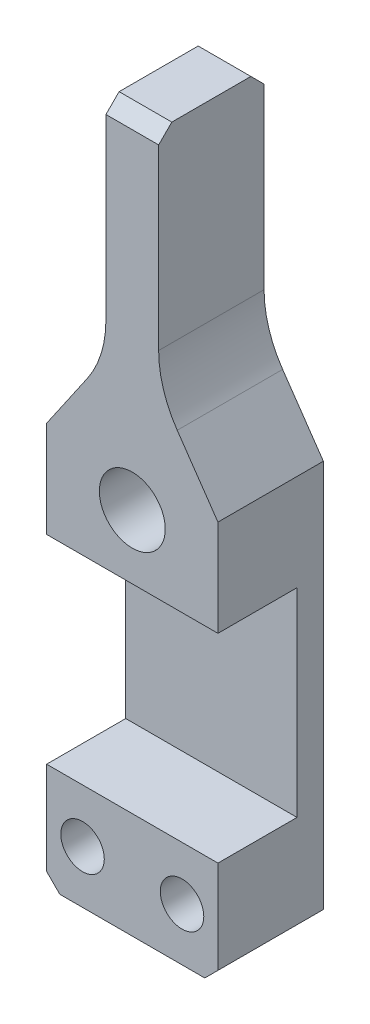
ISO-10303-21;
HEADER;
FILE_DESCRIPTION(('STEP AP214'),'2;1');
FILE_NAME('part.step','',(''),(''),'','','');
FILE_SCHEMA(('AUTOMOTIVE_DESIGN { 1 0 10303 214 1 1 1 1 }'));
ENDSEC;
DATA;
#1=APPLICATION_CONTEXT('core data for automotive mechanical design processes');
#2=APPLICATION_PROTOCOL_DEFINITION('international standard','automotive_design',2000,#1);
#3=PRODUCT_CONTEXT('',#1,'mechanical');
#4=PRODUCT('Part','Part','',(#3));
#5=PRODUCT_RELATED_PRODUCT_CATEGORY('part','',(#4));
#6=PRODUCT_DEFINITION_FORMATION('','',#4);
#7=PRODUCT_DEFINITION_CONTEXT('part definition',#1,'design');
#8=PRODUCT_DEFINITION('design','',#6,#7);
#9=PRODUCT_DEFINITION_SHAPE('','',#8);
#10=(LENGTH_UNIT() NAMED_UNIT(*) SI_UNIT(.MILLI.,.METRE.));
#11=(NAMED_UNIT(*) PLANE_ANGLE_UNIT() SI_UNIT($,.RADIAN.));
#12=(NAMED_UNIT(*) SI_UNIT($,.STERADIAN.) SOLID_ANGLE_UNIT());
#13=UNCERTAINTY_MEASURE_WITH_UNIT(LENGTH_MEASURE(1.E-05),#10,'distance_accuracy_value','');
#14=(GEOMETRIC_REPRESENTATION_CONTEXT(3) GLOBAL_UNCERTAINTY_ASSIGNED_CONTEXT((#13)) GLOBAL_UNIT_ASSIGNED_CONTEXT((#10,
#11,#12)) REPRESENTATION_CONTEXT('',''));
#15=CARTESIAN_POINT('',(0.,0.,0.));
#16=DIRECTION('',(0.,0.,1.));
#17=DIRECTION('',(1.,0.,0.));
#18=AXIS2_PLACEMENT_3D('',#15,#16,#17);
#19=CARTESIAN_POINT('',(0.,0.,8.));
#20=DIRECTION('',(0.,0.,-1.));
#21=DIRECTION('',(-1.,0.,0.));
#22=AXIS2_PLACEMENT_3D('',#19,#20,#21);
#23=PLANE('',#22);
#24=CARTESIAN_POINT('',(0.,0.500000000000004,8.));
#25=DIRECTION('',(0.,0.,1.));
#26=DIRECTION('',(1.,0.,0.));
#27=AXIS2_PLACEMENT_3D('',#24,#25,#26);
#28=CIRCLE('',#27,2.5);
#29=CARTESIAN_POINT('',(2.5,0.500000000000004,8.));
#30=VERTEX_POINT('',#29);
#31=EDGE_CURVE('E349',#30,#30,#28,.T.);
#32=ORIENTED_EDGE('',*,*,#31,.F.);
#33=EDGE_LOOP('',(#32));
#34=FACE_BOUND('',#33,.T.);
#35=DIRECTION('',(0.,-1.,0.));
#36=VECTOR('',#35,1.);
#37=CARTESIAN_POINT('',(-6.5,27.5,8.));
#38=LINE('',#37,#36);
#39=CARTESIAN_POINT('',(-6.5,2.96165158468899,8.));
#40=VERTEX_POINT('',#39);
#41=CARTESIAN_POINT('',(-6.5,-4.34917334973761,8.));
#42=VERTEX_POINT('',#41);
#43=EDGE_CURVE('E178',#40,#42,#38,.T.);
#44=ORIENTED_EDGE('',*,*,#43,.T.);
#45=DIRECTION('',(1.,0.,0.));
#46=VECTOR('',#45,1.);
#47=CARTESIAN_POINT('',(-6.5,-4.34917334973761,8.));
#48=LINE('',#47,#46);
#49=CARTESIAN_POINT('',(6.5,-4.34917334973761,8.));
#50=VERTEX_POINT('',#49);
#51=EDGE_CURVE('E163',#42,#50,#48,.T.);
#52=ORIENTED_EDGE('',*,*,#51,.T.);
#53=DIRECTION('',(0.,1.,0.));
#54=VECTOR('',#53,1.);
#55=CARTESIAN_POINT('',(6.5,27.5,8.));
#56=LINE('',#55,#54);
#57=CARTESIAN_POINT('',(6.5,2.96165158468893,8.));
#58=VERTEX_POINT('',#57);
#59=EDGE_CURVE('E188',#50,#58,#56,.T.);
#60=ORIENTED_EDGE('',*,*,#59,.T.);
#61=DIRECTION('',(-0.566946709513834,0.823754471047919,0.));
#62=VECTOR('',#61,1.);
#63=CARTESIAN_POINT('',(6.5,2.96165158468891,8.));
#64=LINE('',#63,#62);
#65=CARTESIAN_POINT('',(3.40996423161665,7.45136946679201,8.));
#66=VERTEX_POINT('',#65);
#67=EDGE_CURVE('E229',#58,#66,#64,.T.);
#68=ORIENTED_EDGE('',*,*,#67,.T.);
#69=CARTESIAN_POINT('',(10.,11.9869431429027,8.));
#70=DIRECTION('',(0.,0.,-1.));
#71=DIRECTION('',(-1.,0.,0.));
#72=AXIS2_PLACEMENT_3D('',#69,#70,#71);
#73=CIRCLE('',#72,8.);
#74=CARTESIAN_POINT('',(2.,11.9869431429027,8.));
#75=VERTEX_POINT('',#74);
#76=EDGE_CURVE('E271',#66,#75,#73,.T.);
#77=ORIENTED_EDGE('',*,*,#76,.T.);
#78=DIRECTION('',(0.,-1.,0.));
#79=VECTOR('',#78,1.);
#80=CARTESIAN_POINT('',(2.,27.5,8.));
#81=LINE('',#80,#79);
#82=CARTESIAN_POINT('',(2.,25.5,8.));
#83=VERTEX_POINT('',#82);
#84=EDGE_CURVE('E275',#83,#75,#81,.T.);
#85=ORIENTED_EDGE('',*,*,#84,.F.);
#86=DIRECTION('',(-1.,0.,0.));
#87=VECTOR('',#86,1.);
#88=CARTESIAN_POINT('',(0.,25.5,8.));
#89=LINE('',#88,#87);
#90=CARTESIAN_POINT('',(-2.,25.5,8.));
#91=VERTEX_POINT('',#90);
#92=EDGE_CURVE('E256',#83,#91,#89,.T.);
#93=ORIENTED_EDGE('',*,*,#92,.T.);
#94=DIRECTION('',(0.,1.,0.));
#95=VECTOR('',#94,1.);
#96=CARTESIAN_POINT('',(-2.,27.5,8.));
#97=LINE('',#96,#95);
#98=CARTESIAN_POINT('',(-2.,11.9869431429027,8.));
#99=VERTEX_POINT('',#98);
#100=EDGE_CURVE('E346',#99,#91,#97,.T.);
#101=ORIENTED_EDGE('',*,*,#100,.F.);
#102=CARTESIAN_POINT('',(-10.,11.9869431429027,8.));
#103=DIRECTION('',(0.,0.,-1.));
#104=DIRECTION('',(-1.,0.,0.));
#105=AXIS2_PLACEMENT_3D('',#102,#103,#104);
#106=CIRCLE('',#105,8.);
#107=CARTESIAN_POINT('',(-3.40996423161669,7.45136946679193,8.));
#108=VERTEX_POINT('',#107);
#109=EDGE_CURVE('E48',#99,#108,#106,.T.);
#110=ORIENTED_EDGE('',*,*,#109,.T.);
#111=DIRECTION('',(-0.566946709513842,-0.823754471047913,0.));
#112=VECTOR('',#111,1.);
#113=CARTESIAN_POINT('',(-3.28571428571426,7.6319004527683,8.));
#114=LINE('',#113,#112);
#115=EDGE_CURVE('E183',#108,#40,#114,.T.);
#116=ORIENTED_EDGE('',*,*,#115,.T.);
#117=EDGE_LOOP('',(#44,#52,#60,#68,#77,#85,#93,#101,#110,#116));
#118=FACE_BOUND('',#117,.T.);
#119=ADVANCED_FACE('F40',(#34,#118),#23,.F.);
#120=CARTESIAN_POINT('',(-6.5,27.5,8.));
#121=DIRECTION('',(1.,0.,0.));
#122=DIRECTION('',(0.,1.,0.));
#123=AXIS2_PLACEMENT_3D('',#120,#121,#122);
#124=PLANE('',#123);
#125=DIRECTION('',(0.,1.,0.));
#126=VECTOR('',#125,1.);
#127=CARTESIAN_POINT('',(-6.5,-4.34917334973761,1.9988763965415));
#128=LINE('',#127,#126);
#129=CARTESIAN_POINT('',(-6.5,-19.4477044804842,1.9988763965415));
#130=VERTEX_POINT('',#129);
#131=CARTESIAN_POINT('',(-6.5,-4.34917334973761,1.9988763965415));
#132=VERTEX_POINT('',#131);
#133=EDGE_CURVE('E173',#130,#132,#128,.T.);
#134=ORIENTED_EDGE('',*,*,#133,.T.);
#135=DIRECTION('',(0.,0.,1.));
#136=VECTOR('',#135,1.);
#137=CARTESIAN_POINT('',(-6.5,-4.34917334973761,8.));
#138=LINE('',#137,#136);
#139=EDGE_CURVE('E166',#132,#42,#138,.T.);
#140=ORIENTED_EDGE('',*,*,#139,.T.);
#141=ORIENTED_EDGE('',*,*,#43,.F.);
#142=DIRECTION('',(0.,0.,-1.));
#143=VECTOR('',#142,1.);
#144=CARTESIAN_POINT('',(-6.5,2.96165158468899,8.));
#145=LINE('',#144,#143);
#146=CARTESIAN_POINT('',(-6.49999999999999,2.96165158468902,0.));
#147=VERTEX_POINT('',#146);
#148=EDGE_CURVE('E237',#40,#147,#145,.T.);
#149=ORIENTED_EDGE('',*,*,#148,.T.);
#150=DIRECTION('',(0.,-1.,0.));
#151=VECTOR('',#150,1.);
#152=CARTESIAN_POINT('',(-6.5,27.5,0.));
#153=LINE('',#152,#151);
#154=CARTESIAN_POINT('',(-6.5,-26.5,0.));
#155=VERTEX_POINT('',#154);
#156=EDGE_CURVE('E199',#147,#155,#153,.T.);
#157=ORIENTED_EDGE('',*,*,#156,.T.);
#158=DIRECTION('',(0.,0.,1.));
#159=VECTOR('',#158,1.);
#160=CARTESIAN_POINT('',(-6.5,-26.5,8.));
#161=LINE('',#160,#159);
#162=CARTESIAN_POINT('',(-6.49999999999999,-26.5,8.));
#163=VERTEX_POINT('',#162);
#164=EDGE_CURVE('E222',#155,#163,#161,.T.);
#165=ORIENTED_EDGE('',*,*,#164,.T.);
#166=CARTESIAN_POINT('',(-6.5,-19.4477044804842,8.));
#167=VERTEX_POINT('',#166);
#168=EDGE_CURVE('E185',#167,#163,#38,.T.);
#169=ORIENTED_EDGE('',*,*,#168,.F.);
#170=DIRECTION('',(0.,0.,-1.));
#171=VECTOR('',#170,1.);
#172=CARTESIAN_POINT('',(-6.5,-19.4477044804842,8.));
#173=LINE('',#172,#171);
#174=EDGE_CURVE('E55',#167,#130,#173,.T.);
#175=ORIENTED_EDGE('',*,*,#174,.T.);
#176=EDGE_LOOP('',(#134,#140,#141,#149,#157,#165,#169,#175));
#177=FACE_BOUND('',#176,.T.);
#178=ADVANCED_FACE('F177',(#177),#124,.F.);
#179=CARTESIAN_POINT('',(6.50000000000001,-27.5,8.));
#180=DIRECTION('',(0.,1.,0.));
#181=DIRECTION('',(0.,0.,1.));
#182=AXIS2_PLACEMENT_3D('',#179,#180,#181);
#183=PLANE('',#182);
#184=DIRECTION('',(1.,0.,0.));
#185=VECTOR('',#184,1.);
#186=CARTESIAN_POINT('',(6.50000000000001,-27.5,0.));
#187=LINE('',#186,#185);
#188=CARTESIAN_POINT('',(-5.50000000000001,-27.5,0.));
#189=VERTEX_POINT('',#188);
#190=CARTESIAN_POINT('',(5.5,-27.5,0.));
#191=VERTEX_POINT('',#190);
#192=EDGE_CURVE('E201',#189,#191,#187,.T.);
#193=ORIENTED_EDGE('',*,*,#192,.T.);
#194=DIRECTION('',(0.,0.,1.));
#195=VECTOR('',#194,1.);
#196=CARTESIAN_POINT('',(5.5,-27.5,8.));
#197=LINE('',#196,#195);
#198=CARTESIAN_POINT('',(5.5,-27.5,8.));
#199=VERTEX_POINT('',#198);
#200=EDGE_CURVE('E216',#191,#199,#197,.T.);
#201=ORIENTED_EDGE('',*,*,#200,.T.);
#202=DIRECTION('',(1.,0.,0.));
#203=VECTOR('',#202,1.);
#204=CARTESIAN_POINT('',(6.50000000000001,-27.5,8.));
#205=LINE('',#204,#203);
#206=CARTESIAN_POINT('',(-5.5,-27.5,8.));
#207=VERTEX_POINT('',#206);
#208=EDGE_CURVE('E184',#207,#199,#205,.T.);
#209=ORIENTED_EDGE('',*,*,#208,.F.);
#210=DIRECTION('',(0.,0.,-1.));
#211=VECTOR('',#210,1.);
#212=CARTESIAN_POINT('',(-5.5,-27.5,8.));
#213=LINE('',#212,#211);
#214=EDGE_CURVE('E213',#207,#189,#213,.T.);
#215=ORIENTED_EDGE('',*,*,#214,.T.);
#216=EDGE_LOOP('',(#193,#201,#209,#215));
#217=FACE_BOUND('',#216,.T.);
#218=ADVANCED_FACE('F306',(#217),#183,.F.);
#219=CARTESIAN_POINT('',(6.5,27.5,8.));
#220=DIRECTION('',(-1.,0.,0.));
#221=DIRECTION('',(0.,-1.,0.));
#222=AXIS2_PLACEMENT_3D('',#219,#220,#221);
#223=PLANE('',#222);
#224=ORIENTED_EDGE('',*,*,#59,.F.);
#225=DIRECTION('',(0.,0.,1.));
#226=VECTOR('',#225,1.);
#227=CARTESIAN_POINT('',(6.5,-4.34917334973761,8.));
#228=LINE('',#227,#226);
#229=CARTESIAN_POINT('',(6.5,-4.34917334973761,1.9988763965415));
#230=VERTEX_POINT('',#229);
#231=EDGE_CURVE('E169',#230,#50,#228,.T.);
#232=ORIENTED_EDGE('',*,*,#231,.F.);
#233=DIRECTION('',(0.,1.,0.));
#234=VECTOR('',#233,1.);
#235=CARTESIAN_POINT('',(6.5,-4.34917334973761,1.9988763965415));
#236=LINE('',#235,#234);
#237=CARTESIAN_POINT('',(6.5,-19.4477044804842,1.9988763965415));
#238=VERTEX_POINT('',#237);
#239=EDGE_CURVE('E181',#238,#230,#236,.T.);
#240=ORIENTED_EDGE('',*,*,#239,.F.);
#241=DIRECTION('',(0.,0.,-1.));
#242=VECTOR('',#241,1.);
#243=CARTESIAN_POINT('',(6.5,-19.4477044804842,8.));
#244=LINE('',#243,#242);
#245=CARTESIAN_POINT('',(6.5,-19.4477044804842,8.));
#246=VERTEX_POINT('',#245);
#247=EDGE_CURVE('E316',#246,#238,#244,.T.);
#248=ORIENTED_EDGE('',*,*,#247,.F.);
#249=CARTESIAN_POINT('',(6.50000000000001,-26.5,8.));
#250=VERTEX_POINT('',#249);
#251=EDGE_CURVE('E195',#250,#246,#56,.T.);
#252=ORIENTED_EDGE('',*,*,#251,.F.);
#253=DIRECTION('',(0.,0.,-1.));
#254=VECTOR('',#253,1.);
#255=CARTESIAN_POINT('',(6.50000000000001,-26.5,8.));
#256=LINE('',#255,#254);
#257=CARTESIAN_POINT('',(6.50000000000001,-26.5,0.));
#258=VERTEX_POINT('',#257);
#259=EDGE_CURVE('E198',#250,#258,#256,.T.);
#260=ORIENTED_EDGE('',*,*,#259,.T.);
#261=DIRECTION('',(0.,1.,0.));
#262=VECTOR('',#261,1.);
#263=CARTESIAN_POINT('',(6.5,27.5,0.));
#264=LINE('',#263,#262);
#265=CARTESIAN_POINT('',(6.5,2.96165158468892,0.));
#266=VERTEX_POINT('',#265);
#267=EDGE_CURVE('E190',#258,#266,#264,.T.);
#268=ORIENTED_EDGE('',*,*,#267,.T.);
#269=DIRECTION('',(0.,0.,1.));
#270=VECTOR('',#269,1.);
#271=CARTESIAN_POINT('',(6.5,2.96165158468891,8.));
#272=LINE('',#271,#270);
#273=EDGE_CURVE('E225',#266,#58,#272,.T.);
#274=ORIENTED_EDGE('',*,*,#273,.T.);
#275=EDGE_LOOP('',(#224,#232,#240,#248,#252,#260,#268,#274));
#276=FACE_BOUND('',#275,.T.);
#277=ADVANCED_FACE('F299',(#276),#223,.F.);
#278=CARTESIAN_POINT('',(-3.77499999991079,-23.5,8.));
#279=DIRECTION('',(0.,0.,1.));
#280=DIRECTION('',(1.,0.,0.));
#281=AXIS2_PLACEMENT_3D('',#278,#279,#280);
#282=CIRCLE('',#281,1.64999999999999);
#283=CARTESIAN_POINT('',(-2.1249999999108,-23.5,8.));
#284=VERTEX_POINT('',#283);
#285=EDGE_CURVE('E334',#284,#284,#282,.T.);
#286=ORIENTED_EDGE('',*,*,#285,.F.);
#287=EDGE_LOOP('',(#286));
#288=FACE_BOUND('',#287,.T.);
#289=CARTESIAN_POINT('',(3.77499999994489,-23.5,8.));
#290=DIRECTION('',(0.,0.,1.));
#291=DIRECTION('',(1.,0.,0.));
#292=AXIS2_PLACEMENT_3D('',#289,#290,#291);
#293=CIRCLE('',#292,1.64999999999999);
#294=CARTESIAN_POINT('',(5.42499999994488,-23.5,8.));
#295=VERTEX_POINT('',#294);
#296=EDGE_CURVE('E340',#295,#295,#293,.T.);
#297=ORIENTED_EDGE('',*,*,#296,.F.);
#298=EDGE_LOOP('',(#297));
#299=FACE_BOUND('',#298,.T.);
#300=ORIENTED_EDGE('',*,*,#251,.T.);
#301=DIRECTION('',(1.,0.,0.));
#302=VECTOR('',#301,1.);
#303=CARTESIAN_POINT('',(-6.5,-19.4477044804842,8.));
#304=LINE('',#303,#302);
#305=EDGE_CURVE('E172',#167,#246,#304,.T.);
#306=ORIENTED_EDGE('',*,*,#305,.F.);
#307=ORIENTED_EDGE('',*,*,#168,.T.);
#308=DIRECTION('',(-0.707106781186545,0.70710678118655,0.));
#309=VECTOR('',#308,1.);
#310=CARTESIAN_POINT('',(-5.5,-27.5,8.));
#311=LINE('',#310,#309);
#312=EDGE_CURVE('E218',#163,#207,#311,.F.);
#313=ORIENTED_EDGE('',*,*,#312,.T.);
#314=ORIENTED_EDGE('',*,*,#208,.T.);
#315=DIRECTION('',(-0.70710678118655,-0.707106781186545,0.));
#316=VECTOR('',#315,1.);
#317=CARTESIAN_POINT('',(6.50000000000001,-26.5,8.));
#318=LINE('',#317,#316);
#319=EDGE_CURVE('E220',#199,#250,#318,.F.);
#320=ORIENTED_EDGE('',*,*,#319,.T.);
#321=EDGE_LOOP('',(#300,#306,#307,#313,#314,#320));
#322=FACE_BOUND('',#321,.T.);
#323=ADVANCED_FACE('F312',(#288,#299,#322),#23,.F.);
#324=CARTESIAN_POINT('',(0.,0.,0.));
#325=DIRECTION('',(0.,0.,-1.));
#326=DIRECTION('',(-1.,0.,0.));
#327=AXIS2_PLACEMENT_3D('',#324,#325,#326);
#328=PLANE('',#327);
#329=DIRECTION('',(0.566946709513842,0.823754471047913,0.));
#330=VECTOR('',#329,1.);
#331=CARTESIAN_POINT('',(-5.79387928181817,3.98762120218729,0.));
#332=LINE('',#331,#330);
#333=CARTESIAN_POINT('',(-3.40996423161669,7.45136946679193,0.));
#334=VERTEX_POINT('',#333);
#335=EDGE_CURVE('E232',#147,#334,#332,.T.);
#336=ORIENTED_EDGE('',*,*,#335,.T.);
#337=CARTESIAN_POINT('',(-10.,11.9869431429027,0.));
#338=DIRECTION('',(0.,0.,-1.));
#339=DIRECTION('',(-1.,0.,0.));
#340=AXIS2_PLACEMENT_3D('',#337,#338,#339);
#341=CIRCLE('',#340,8.);
#342=CARTESIAN_POINT('',(-2.,11.9869431429027,0.));
#343=VERTEX_POINT('',#342);
#344=EDGE_CURVE('E11',#334,#343,#341,.F.);
#345=ORIENTED_EDGE('',*,*,#344,.T.);
#346=DIRECTION('',(0.,1.,0.));
#347=VECTOR('',#346,1.);
#348=CARTESIAN_POINT('',(-2.,27.5,0.));
#349=LINE('',#348,#347);
#350=CARTESIAN_POINT('',(-2.,25.5,0.));
#351=VERTEX_POINT('',#350);
#352=EDGE_CURVE('E287',#343,#351,#349,.T.);
#353=ORIENTED_EDGE('',*,*,#352,.T.);
#354=DIRECTION('',(1.,0.,0.));
#355=VECTOR('',#354,1.);
#356=CARTESIAN_POINT('',(2.,25.5,0.));
#357=LINE('',#356,#355);
#358=CARTESIAN_POINT('',(2.,25.5,0.));
#359=VERTEX_POINT('',#358);
#360=EDGE_CURVE('E250',#351,#359,#357,.T.);
#361=ORIENTED_EDGE('',*,*,#360,.T.);
#362=DIRECTION('',(0.,-1.,0.));
#363=VECTOR('',#362,1.);
#364=CARTESIAN_POINT('',(2.,27.5,0.));
#365=LINE('',#364,#363);
#366=CARTESIAN_POINT('',(2.,11.9869431429027,0.));
#367=VERTEX_POINT('',#366);
#368=EDGE_CURVE('E286',#359,#367,#365,.T.);
#369=ORIENTED_EDGE('',*,*,#368,.T.);
#370=CARTESIAN_POINT('',(10.,11.9869431429027,0.));
#371=DIRECTION('',(0.,0.,-1.));
#372=DIRECTION('',(-1.,0.,0.));
#373=AXIS2_PLACEMENT_3D('',#370,#371,#372);
#374=CIRCLE('',#373,8.);
#375=CARTESIAN_POINT('',(3.40996423161665,7.45136946679201,0.));
#376=VERTEX_POINT('',#375);
#377=EDGE_CURVE('E269',#367,#376,#374,.F.);
#378=ORIENTED_EDGE('',*,*,#377,.T.);
#379=DIRECTION('',(0.566946709513834,-0.823754471047919,0.));
#380=VECTOR('',#379,1.);
#381=CARTESIAN_POINT('',(5.79387928181819,3.98762120218722,0.));
#382=LINE('',#381,#380);
#383=EDGE_CURVE('E235',#376,#266,#382,.T.);
#384=ORIENTED_EDGE('',*,*,#383,.T.);
#385=ORIENTED_EDGE('',*,*,#267,.F.);
#386=DIRECTION('',(0.70710678118655,0.707106781186545,0.));
#387=VECTOR('',#386,1.);
#388=CARTESIAN_POINT('',(16.5,-16.5000000000001,0.));
#389=LINE('',#388,#387);
#390=EDGE_CURVE('E211',#258,#191,#389,.F.);
#391=ORIENTED_EDGE('',*,*,#390,.T.);
#392=ORIENTED_EDGE('',*,*,#192,.F.);
#393=DIRECTION('',(0.707106781186545,-0.70710678118655,0.));
#394=VECTOR('',#393,1.);
#395=CARTESIAN_POINT('',(-16.5,-16.4999999999999,0.));
#396=LINE('',#395,#394);
#397=EDGE_CURVE('E208',#189,#155,#396,.F.);
#398=ORIENTED_EDGE('',*,*,#397,.T.);
#399=ORIENTED_EDGE('',*,*,#156,.F.);
#400=EDGE_LOOP('',(#336,#345,#353,#361,#369,#378,#384,#385,#391,#392,#398,#399));
#401=FACE_BOUND('',#400,.T.);
#402=CARTESIAN_POINT('',(-3.77499999991079,-23.5,0.));
#403=DIRECTION('',(0.,0.,1.));
#404=DIRECTION('',(1.,0.,0.));
#405=AXIS2_PLACEMENT_3D('',#402,#403,#404);
#406=CIRCLE('',#405,1.65);
#407=CARTESIAN_POINT('',(-2.12499999991079,-23.5,0.));
#408=VERTEX_POINT('',#407);
#409=EDGE_CURVE('E337',#408,#408,#406,.T.);
#410=ORIENTED_EDGE('',*,*,#409,.T.);
#411=EDGE_LOOP('',(#410));
#412=FACE_BOUND('',#411,.T.);
#413=CARTESIAN_POINT('',(3.77499999994489,-23.5,0.));
#414=DIRECTION('',(0.,0.,1.));
#415=DIRECTION('',(1.,0.,0.));
#416=AXIS2_PLACEMENT_3D('',#413,#414,#415);
#417=CIRCLE('',#416,1.65);
#418=CARTESIAN_POINT('',(5.42499999994489,-23.5,0.));
#419=VERTEX_POINT('',#418);
#420=EDGE_CURVE('E343',#419,#419,#417,.T.);
#421=ORIENTED_EDGE('',*,*,#420,.T.);
#422=EDGE_LOOP('',(#421));
#423=FACE_BOUND('',#422,.T.);
#424=CARTESIAN_POINT('',(0.,0.500000000000004,0.));
#425=DIRECTION('',(0.,0.,1.));
#426=DIRECTION('',(1.,0.,0.));
#427=AXIS2_PLACEMENT_3D('',#424,#425,#426);
#428=CIRCLE('',#427,2.5);
#429=CARTESIAN_POINT('',(2.5,0.500000000000004,0.));
#430=VERTEX_POINT('',#429);
#431=EDGE_CURVE('E192',#430,#430,#428,.T.);
#432=ORIENTED_EDGE('',*,*,#431,.T.);
#433=EDGE_LOOP('',(#432));
#434=FACE_BOUND('',#433,.T.);
#435=ADVANCED_FACE('F292',(#401,#412,#423,#434),#328,.T.);
#436=CARTESIAN_POINT('',(0.,0.500000000000004,8.));
#437=DIRECTION('',(0.,0.,1.));
#438=DIRECTION('',(1.,0.,0.));
#439=AXIS2_PLACEMENT_3D('',#436,#437,#438);
#440=CYLINDRICAL_SURFACE('',#439,2.5);
#441=ORIENTED_EDGE('',*,*,#431,.F.);
#442=EDGE_LOOP('',(#441));
#443=FACE_BOUND('',#442,.T.);
#444=ORIENTED_EDGE('',*,*,#31,.T.);
#445=EDGE_LOOP('',(#444));
#446=FACE_BOUND('',#445,.T.);
#447=ADVANCED_FACE('F357',(#443,#446),#440,.F.);
#448=CARTESIAN_POINT('',(2.,27.5,0.));
#449=DIRECTION('',(-1.,0.,0.));
#450=DIRECTION('',(0.,-1.,0.));
#451=AXIS2_PLACEMENT_3D('',#448,#449,#450);
#452=PLANE('',#451);
#453=ORIENTED_EDGE('',*,*,#84,.T.);
#454=DIRECTION('',(0.,0.,-1.));
#455=VECTOR('',#454,1.);
#456=CARTESIAN_POINT('',(2.,11.9869431429027,0.));
#457=LINE('',#456,#455);
#458=EDGE_CURVE('E259',#75,#367,#457,.T.);
#459=ORIENTED_EDGE('',*,*,#458,.T.);
#460=ORIENTED_EDGE('',*,*,#368,.F.);
#461=DIRECTION('',(0.,0.70710678118655,0.707106781186545));
#462=VECTOR('',#461,1.);
#463=CARTESIAN_POINT('',(2.,26.5,1.));
#464=LINE('',#463,#462);
#465=CARTESIAN_POINT('',(2.,26.5,1.));
#466=VERTEX_POINT('',#465);
#467=EDGE_CURVE('E254',#359,#466,#464,.T.);
#468=ORIENTED_EDGE('',*,*,#467,.T.);
#469=DIRECTION('',(0.,0.,-1.));
#470=VECTOR('',#469,1.);
#471=CARTESIAN_POINT('',(2.,26.5,0.));
#472=LINE('',#471,#470);
#473=CARTESIAN_POINT('',(2.,26.5,7.));
#474=VERTEX_POINT('',#473);
#475=EDGE_CURVE('E325',#474,#466,#472,.T.);
#476=ORIENTED_EDGE('',*,*,#475,.F.);
#477=DIRECTION('',(0.,0.70710678118655,-0.707106781186545));
#478=VECTOR('',#477,1.);
#479=CARTESIAN_POINT('',(2.,26.5,7.));
#480=LINE('',#479,#478);
#481=EDGE_CURVE('E252',#474,#83,#480,.F.);
#482=ORIENTED_EDGE('',*,*,#481,.T.);
#483=EDGE_LOOP('',(#453,#459,#460,#468,#476,#482));
#484=FACE_BOUND('',#483,.T.);
#485=ADVANCED_FACE('F282',(#484),#452,.F.);
#486=CARTESIAN_POINT('',(-2.,27.5,0.));
#487=DIRECTION('',(1.,0.,0.));
#488=DIRECTION('',(0.,0.,-1.));
#489=AXIS2_PLACEMENT_3D('',#486,#487,#488);
#490=PLANE('',#489);
#491=ORIENTED_EDGE('',*,*,#352,.F.);
#492=DIRECTION('',(0.,0.,1.));
#493=VECTOR('',#492,1.);
#494=CARTESIAN_POINT('',(-2.,11.9869431429027,0.));
#495=LINE('',#494,#493);
#496=EDGE_CURVE('E264',#343,#99,#495,.T.);
#497=ORIENTED_EDGE('',*,*,#496,.T.);
#498=ORIENTED_EDGE('',*,*,#100,.T.);
#499=DIRECTION('',(0.,-0.70710678118655,0.707106781186545));
#500=VECTOR('',#499,1.);
#501=CARTESIAN_POINT('',(-2.,26.5,7.));
#502=LINE('',#501,#500);
#503=CARTESIAN_POINT('',(-2.,26.5,7.));
#504=VERTEX_POINT('',#503);
#505=EDGE_CURVE('E245',#91,#504,#502,.F.);
#506=ORIENTED_EDGE('',*,*,#505,.T.);
#507=DIRECTION('',(0.,0.,1.));
#508=VECTOR('',#507,1.);
#509=CARTESIAN_POINT('',(-2.,26.5,0.));
#510=LINE('',#509,#508);
#511=CARTESIAN_POINT('',(-2.,26.5,1.));
#512=VERTEX_POINT('',#511);
#513=EDGE_CURVE('E331',#512,#504,#510,.T.);
#514=ORIENTED_EDGE('',*,*,#513,.F.);
#515=DIRECTION('',(0.,-0.70710678118655,-0.707106781186545));
#516=VECTOR('',#515,1.);
#517=CARTESIAN_POINT('',(-2.,26.5,1.));
#518=LINE('',#517,#516);
#519=EDGE_CURVE('E247',#512,#351,#518,.T.);
#520=ORIENTED_EDGE('',*,*,#519,.T.);
#521=EDGE_LOOP('',(#491,#497,#498,#506,#514,#520));
#522=FACE_BOUND('',#521,.T.);
#523=ADVANCED_FACE('F364',(#522),#490,.F.);
#524=CARTESIAN_POINT('',(6.50000000000001,-26.5,8.));
#525=DIRECTION('',(-0.707106781186545,0.70710678118655,0.));
#526=DIRECTION('',(0.,0.,-1.));
#527=AXIS2_PLACEMENT_3D('',#524,#525,#526);
#528=PLANE('',#527);
#529=ORIENTED_EDGE('',*,*,#319,.F.);
#530=ORIENTED_EDGE('',*,*,#200,.F.);
#531=ORIENTED_EDGE('',*,*,#390,.F.);
#532=ORIENTED_EDGE('',*,*,#259,.F.);
#533=EDGE_LOOP('',(#529,#530,#531,#532));
#534=FACE_BOUND('',#533,.T.);
#535=ADVANCED_FACE('F310',(#534),#528,.F.);
#536=CARTESIAN_POINT('',(-5.5,-27.5,8.));
#537=DIRECTION('',(0.70710678118655,0.707106781186545,0.));
#538=DIRECTION('',(0.,0.,-1.));
#539=AXIS2_PLACEMENT_3D('',#536,#537,#538);
#540=PLANE('',#539);
#541=ORIENTED_EDGE('',*,*,#312,.F.);
#542=ORIENTED_EDGE('',*,*,#164,.F.);
#543=ORIENTED_EDGE('',*,*,#397,.F.);
#544=ORIENTED_EDGE('',*,*,#214,.F.);
#545=EDGE_LOOP('',(#541,#542,#543,#544));
#546=FACE_BOUND('',#545,.T.);
#547=ADVANCED_FACE('F387',(#546),#540,.F.);
#548=CARTESIAN_POINT('',(3.77499999994489,-23.5,8.));
#549=DIRECTION('',(0.,0.,1.));
#550=DIRECTION('',(1.,0.,0.));
#551=AXIS2_PLACEMENT_3D('',#548,#549,#550);
#552=CYLINDRICAL_SURFACE('',#551,1.64999999999999);
#553=ORIENTED_EDGE('',*,*,#420,.F.);
#554=EDGE_LOOP('',(#553));
#555=FACE_BOUND('',#554,.T.);
#556=ORIENTED_EDGE('',*,*,#296,.T.);
#557=EDGE_LOOP('',(#556));
#558=FACE_BOUND('',#557,.T.);
#559=ADVANCED_FACE('F384',(#555,#558),#552,.F.);
#560=CARTESIAN_POINT('',(-3.77499999991079,-23.5,8.));
#561=DIRECTION('',(0.,0.,1.));
#562=DIRECTION('',(1.,0.,0.));
#563=AXIS2_PLACEMENT_3D('',#560,#561,#562);
#564=CYLINDRICAL_SURFACE('',#563,1.64999999999999);
#565=ORIENTED_EDGE('',*,*,#409,.F.);
#566=EDGE_LOOP('',(#565));
#567=FACE_BOUND('',#566,.T.);
#568=ORIENTED_EDGE('',*,*,#285,.T.);
#569=EDGE_LOOP('',(#568));
#570=FACE_BOUND('',#569,.T.);
#571=ADVANCED_FACE('F386',(#567,#570),#564,.F.);
#572=CARTESIAN_POINT('',(6.5,2.96165158468891,0.));
#573=DIRECTION('',(0.823754471047919,0.566946709513834,0.));
#574=DIRECTION('',(0.,0.,-1.));
#575=AXIS2_PLACEMENT_3D('',#572,#573,#574);
#576=PLANE('',#575);
#577=ORIENTED_EDGE('',*,*,#383,.F.);
#578=DIRECTION('',(0.,0.,-1.));
#579=VECTOR('',#578,1.);
#580=CARTESIAN_POINT('',(3.40996423161665,7.45136946679201,0.));
#581=LINE('',#580,#579);
#582=EDGE_CURVE('E262',#376,#66,#581,.F.);
#583=ORIENTED_EDGE('',*,*,#582,.T.);
#584=ORIENTED_EDGE('',*,*,#67,.F.);
#585=ORIENTED_EDGE('',*,*,#273,.F.);
#586=EDGE_LOOP('',(#577,#583,#584,#585));
#587=FACE_BOUND('',#586,.T.);
#588=ADVANCED_FACE('F297',(#587),#576,.T.);
#589=CARTESIAN_POINT('',(-3.28571428571426,7.6319004527683,0.));
#590=DIRECTION('',(-0.823754471047913,0.566946709513842,0.));
#591=DIRECTION('',(0.,0.,-1.));
#592=AXIS2_PLACEMENT_3D('',#589,#590,#591);
#593=PLANE('',#592);
#594=ORIENTED_EDGE('',*,*,#115,.F.);
#595=DIRECTION('',(0.,0.,1.));
#596=VECTOR('',#595,1.);
#597=CARTESIAN_POINT('',(-3.40996423161669,7.45136946679193,0.));
#598=LINE('',#597,#596);
#599=EDGE_CURVE('E267',#108,#334,#598,.F.);
#600=ORIENTED_EDGE('',*,*,#599,.T.);
#601=ORIENTED_EDGE('',*,*,#335,.F.);
#602=ORIENTED_EDGE('',*,*,#148,.F.);
#603=EDGE_LOOP('',(#594,#600,#601,#602));
#604=FACE_BOUND('',#603,.T.);
#605=ADVANCED_FACE('F416',(#604),#593,.T.);
#606=CARTESIAN_POINT('',(0.,26.5,0.));
#607=DIRECTION('',(0.,-1.,0.));
#608=DIRECTION('',(0.,0.,-1.));
#609=AXIS2_PLACEMENT_3D('',#606,#607,#608);
#610=PLANE('',#609);
#611=ORIENTED_EDGE('',*,*,#475,.T.);
#612=DIRECTION('',(-1.,0.,0.));
#613=VECTOR('',#612,1.);
#614=CARTESIAN_POINT('',(-2.,26.5,1.));
#615=LINE('',#614,#613);
#616=EDGE_CURVE('E242',#466,#512,#615,.T.);
#617=ORIENTED_EDGE('',*,*,#616,.T.);
#618=ORIENTED_EDGE('',*,*,#513,.T.);
#619=DIRECTION('',(1.,0.,0.));
#620=VECTOR('',#619,1.);
#621=CARTESIAN_POINT('',(0.,26.5,7.));
#622=LINE('',#621,#620);
#623=EDGE_CURVE('E239',#504,#474,#622,.T.);
#624=ORIENTED_EDGE('',*,*,#623,.T.);
#625=EDGE_LOOP('',(#611,#617,#618,#624));
#626=FACE_BOUND('',#625,.T.);
#627=ADVANCED_FACE('F432',(#626),#610,.F.);
#628=CARTESIAN_POINT('',(0.,26.5,1.));
#629=DIRECTION('',(0.,0.707106781186545,-0.70710678118655));
#630=DIRECTION('',(1.,0.,0.));
#631=AXIS2_PLACEMENT_3D('',#628,#629,#630);
#632=PLANE('',#631);
#633=ORIENTED_EDGE('',*,*,#467,.F.);
#634=ORIENTED_EDGE('',*,*,#360,.F.);
#635=ORIENTED_EDGE('',*,*,#519,.F.);
#636=ORIENTED_EDGE('',*,*,#616,.F.);
#637=EDGE_LOOP('',(#633,#634,#635,#636));
#638=FACE_BOUND('',#637,.T.);
#639=ADVANCED_FACE('F434',(#638),#632,.T.);
#640=CARTESIAN_POINT('',(0.,26.5,7.));
#641=DIRECTION('',(0.,-0.707106781186545,-0.70710678118655));
#642=DIRECTION('',(1.,0.,0.));
#643=AXIS2_PLACEMENT_3D('',#640,#641,#642);
#644=PLANE('',#643);
#645=ORIENTED_EDGE('',*,*,#505,.F.);
#646=ORIENTED_EDGE('',*,*,#92,.F.);
#647=ORIENTED_EDGE('',*,*,#481,.F.);
#648=ORIENTED_EDGE('',*,*,#623,.F.);
#649=EDGE_LOOP('',(#645,#646,#647,#648));
#650=FACE_BOUND('',#649,.T.);
#651=ADVANCED_FACE('F440',(#650),#644,.F.);
#652=CARTESIAN_POINT('',(10.,11.9869431429027,0.));
#653=DIRECTION('',(0.,0.,-1.));
#654=DIRECTION('',(-1.,0.,0.));
#655=AXIS2_PLACEMENT_3D('',#652,#653,#654);
#656=CYLINDRICAL_SURFACE('',#655,8.);
#657=ORIENTED_EDGE('',*,*,#76,.F.);
#658=ORIENTED_EDGE('',*,*,#582,.F.);
#659=ORIENTED_EDGE('',*,*,#377,.F.);
#660=ORIENTED_EDGE('',*,*,#458,.F.);
#661=EDGE_LOOP('',(#657,#658,#659,#660));
#662=FACE_BOUND('',#661,.T.);
#663=ADVANCED_FACE('F289',(#662),#656,.F.);
#664=CARTESIAN_POINT('',(-10.,11.9869431429027,0.));
#665=DIRECTION('',(0.,0.,1.));
#666=DIRECTION('',(1.,0.,0.));
#667=AXIS2_PLACEMENT_3D('',#664,#665,#666);
#668=CYLINDRICAL_SURFACE('',#667,8.);
#669=ORIENTED_EDGE('',*,*,#344,.F.);
#670=ORIENTED_EDGE('',*,*,#599,.F.);
#671=ORIENTED_EDGE('',*,*,#109,.F.);
#672=ORIENTED_EDGE('',*,*,#496,.F.);
#673=EDGE_LOOP('',(#669,#670,#671,#672));
#674=FACE_BOUND('',#673,.T.);
#675=ADVANCED_FACE('F42',(#674),#668,.F.);
#676=CARTESIAN_POINT('',(-6.5,-4.34917334973761,8.));
#677=DIRECTION('',(0.,1.,0.));
#678=DIRECTION('',(-1.,0.,0.));
#679=AXIS2_PLACEMENT_3D('',#676,#677,#678);
#680=PLANE('',#679);
#681=ORIENTED_EDGE('',*,*,#231,.T.);
#682=ORIENTED_EDGE('',*,*,#51,.F.);
#683=ORIENTED_EDGE('',*,*,#139,.F.);
#684=DIRECTION('',(1.,0.,0.));
#685=VECTOR('',#684,1.);
#686=CARTESIAN_POINT('',(-6.5,-4.34917334973761,1.9988763965415));
#687=LINE('',#686,#685);
#688=EDGE_CURVE('E323',#132,#230,#687,.T.);
#689=ORIENTED_EDGE('',*,*,#688,.T.);
#690=EDGE_LOOP('',(#681,#682,#683,#689));
#691=FACE_BOUND('',#690,.T.);
#692=ADVANCED_FACE('F165',(#691),#680,.F.);
#693=CARTESIAN_POINT('',(-6.5,-4.34917334973761,1.9988763965415));
#694=DIRECTION('',(0.,0.,-1.));
#695=DIRECTION('',(-1.,0.,0.));
#696=AXIS2_PLACEMENT_3D('',#693,#694,#695);
#697=PLANE('',#696);
#698=ORIENTED_EDGE('',*,*,#239,.T.);
#699=ORIENTED_EDGE('',*,*,#688,.F.);
#700=ORIENTED_EDGE('',*,*,#133,.F.);
#701=DIRECTION('',(1.,0.,0.));
#702=VECTOR('',#701,1.);
#703=CARTESIAN_POINT('',(-6.5,-19.4477044804842,1.9988763965415));
#704=LINE('',#703,#702);
#705=EDGE_CURVE('E326',#130,#238,#704,.T.);
#706=ORIENTED_EDGE('',*,*,#705,.T.);
#707=EDGE_LOOP('',(#698,#699,#700,#706));
#708=FACE_BOUND('',#707,.T.);
#709=ADVANCED_FACE('F423',(#708),#697,.F.);
#710=CARTESIAN_POINT('',(-6.5,-19.4477044804842,8.));
#711=DIRECTION('',(0.,-1.,0.));
#712=DIRECTION('',(1.,0.,0.));
#713=AXIS2_PLACEMENT_3D('',#710,#711,#712);
#714=PLANE('',#713);
#715=ORIENTED_EDGE('',*,*,#247,.T.);
#716=ORIENTED_EDGE('',*,*,#705,.F.);
#717=ORIENTED_EDGE('',*,*,#174,.F.);
#718=ORIENTED_EDGE('',*,*,#305,.T.);
#719=EDGE_LOOP('',(#715,#716,#717,#718));
#720=FACE_BOUND('',#719,.T.);
#721=ADVANCED_FACE('F421',(#720),#714,.F.);
#722=CLOSED_SHELL('',(#119,#178,#218,#277,#323,#435,#447,#485,#523,#535,#547,#559,#571,#588,
#605,#627,#639,#651,#663,#675,#692,#709,#721));
#723=MANIFOLD_SOLID_BREP('B2',#722);
#724=ADVANCED_BREP_SHAPE_REPRESENTATION('',(#18,#723),#14);
#725=SHAPE_DEFINITION_REPRESENTATION(#9,#724);
ENDSEC;
END-ISO-10303-21;
